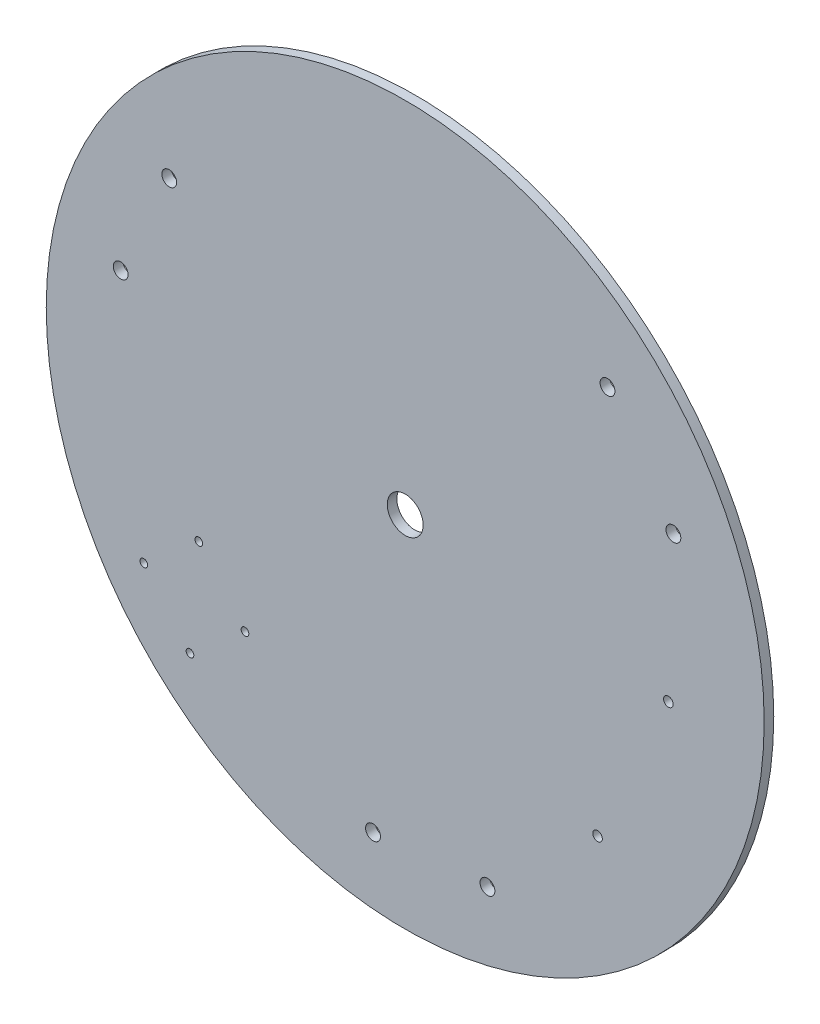
ISO-10303-21;
HEADER;
FILE_DESCRIPTION(('STEP AP214'),'2;1');
FILE_NAME('part.step','',(''),(''),'','','');
FILE_SCHEMA(('AUTOMOTIVE_DESIGN { 1 0 10303 214 1 1 1 1 }'));
ENDSEC;
DATA;
#1=APPLICATION_CONTEXT('core data for automotive mechanical design processes');
#2=APPLICATION_PROTOCOL_DEFINITION('international standard','automotive_design',2000,#1);
#3=PRODUCT_CONTEXT('',#1,'mechanical');
#4=PRODUCT('Part','Part','',(#3));
#5=PRODUCT_RELATED_PRODUCT_CATEGORY('part','',(#4));
#6=PRODUCT_DEFINITION_FORMATION('','',#4);
#7=PRODUCT_DEFINITION_CONTEXT('part definition',#1,'design');
#8=PRODUCT_DEFINITION('design','',#6,#7);
#9=PRODUCT_DEFINITION_SHAPE('','',#8);
#10=(LENGTH_UNIT() NAMED_UNIT(*) SI_UNIT(.MILLI.,.METRE.));
#11=(NAMED_UNIT(*) PLANE_ANGLE_UNIT() SI_UNIT($,.RADIAN.));
#12=(NAMED_UNIT(*) SI_UNIT($,.STERADIAN.) SOLID_ANGLE_UNIT());
#13=UNCERTAINTY_MEASURE_WITH_UNIT(LENGTH_MEASURE(1.E-05),#10,'distance_accuracy_value','');
#14=(GEOMETRIC_REPRESENTATION_CONTEXT(3) GLOBAL_UNCERTAINTY_ASSIGNED_CONTEXT((#13)) GLOBAL_UNIT_ASSIGNED_CONTEXT((#10,
#11,#12)) REPRESENTATION_CONTEXT('',''));
#15=CARTESIAN_POINT('',(0.,0.,0.));
#16=DIRECTION('',(0.,0.,1.));
#17=DIRECTION('',(1.,0.,0.));
#18=AXIS2_PLACEMENT_3D('',#15,#16,#17);
#19=CARTESIAN_POINT('',(0.,0.,4.));
#20=DIRECTION('',(0.,0.,-1.));
#21=DIRECTION('',(-1.,0.,0.));
#22=AXIS2_PLACEMENT_3D('',#19,#20,#21);
#23=CYLINDRICAL_SURFACE('',#22,150.);
#24=CARTESIAN_POINT('',(0.,0.,4.));
#25=DIRECTION('',(0.,0.,1.));
#26=DIRECTION('',(1.,0.,0.));
#27=AXIS2_PLACEMENT_3D('',#24,#25,#26);
#28=CIRCLE('',#27,150.);
#29=CARTESIAN_POINT('',(150.,0.,4.));
#30=VERTEX_POINT('',#29);
#31=EDGE_CURVE('E10',#30,#30,#28,.T.);
#32=ORIENTED_EDGE('',*,*,#31,.F.);
#33=EDGE_LOOP('',(#32));
#34=FACE_BOUND('',#33,.T.);
#35=CARTESIAN_POINT('',(0.,0.,0.));
#36=DIRECTION('',(0.,0.,1.));
#37=DIRECTION('',(1.,0.,0.));
#38=AXIS2_PLACEMENT_3D('',#35,#36,#37);
#39=CIRCLE('',#38,150.);
#40=CARTESIAN_POINT('',(150.,0.,0.));
#41=VERTEX_POINT('',#40);
#42=EDGE_CURVE('E37',#41,#41,#39,.T.);
#43=ORIENTED_EDGE('',*,*,#42,.T.);
#44=EDGE_LOOP('',(#43));
#45=FACE_BOUND('',#44,.T.);
#46=ADVANCED_FACE('F34',(#34,#45),#23,.T.);
#47=CARTESIAN_POINT('',(0.,0.,4.));
#48=DIRECTION('',(0.,0.,1.));
#49=DIRECTION('',(1.,0.,0.));
#50=AXIS2_PLACEMENT_3D('',#47,#48,#49);
#51=PLANE('',#50);
#52=CARTESIAN_POINT('',(-66.9626301666005,-75.7694276154379,4.));
#53=DIRECTION('',(0.,0.,1.));
#54=DIRECTION('',(1.,0.,0.));
#55=AXIS2_PLACEMENT_3D('',#52,#53,#54);
#56=CIRCLE('',#55,1.60000000000001);
#57=CARTESIAN_POINT('',(-65.3626301666005,-75.7694276154379,4.));
#58=VERTEX_POINT('',#57);
#59=EDGE_CURVE('E99',#58,#58,#56,.F.);
#60=ORIENTED_EDGE('',*,*,#59,.T.);
#61=EDGE_LOOP('',(#60));
#62=FACE_BOUND('',#61,.T.);
#63=CARTESIAN_POINT('',(-89.9439634601701,-95.0530559060338,4.));
#64=DIRECTION('',(0.,0.,1.));
#65=DIRECTION('',(1.,0.,0.));
#66=AXIS2_PLACEMENT_3D('',#63,#64,#65);
#67=CIRCLE('',#66,1.60000000000001);
#68=CARTESIAN_POINT('',(-88.3439634601701,-95.0530559060338,4.));
#69=VERTEX_POINT('',#68);
#70=EDGE_CURVE('E110',#69,#69,#67,.F.);
#71=ORIENTED_EDGE('',*,*,#70,.T.);
#72=EDGE_LOOP('',(#71));
#73=FACE_BOUND('',#72,.T.);
#74=CARTESIAN_POINT('',(-109.227591750766,-72.0717226124643,4.));
#75=DIRECTION('',(0.,0.,1.));
#76=DIRECTION('',(1.,0.,0.));
#77=AXIS2_PLACEMENT_3D('',#74,#75,#76);
#78=CIRCLE('',#77,1.60000000000001);
#79=CARTESIAN_POINT('',(-107.627591750766,-72.0717226124643,4.));
#80=VERTEX_POINT('',#79);
#81=EDGE_CURVE('E103',#80,#80,#78,.F.);
#82=ORIENTED_EDGE('',*,*,#81,.T.);
#83=EDGE_LOOP('',(#82));
#84=FACE_BOUND('',#83,.T.);
#85=CARTESIAN_POINT('',(-86.2462584571964,-52.7880943218684,4.));
#86=DIRECTION('',(0.,0.,1.));
#87=DIRECTION('',(1.,0.,0.));
#88=AXIS2_PLACEMENT_3D('',#85,#86,#87);
#89=CIRCLE('',#88,1.60000000000001);
#90=CARTESIAN_POINT('',(-84.6462584571965,-52.7880943218684,4.));
#91=VERTEX_POINT('',#90);
#92=EDGE_CURVE('E104',#91,#91,#89,.F.);
#93=ORIENTED_EDGE('',*,*,#92,.T.);
#94=EDGE_LOOP('',(#93));
#95=FACE_BOUND('',#94,.T.);
#96=CARTESIAN_POINT('',(0.,0.,4.));
#97=DIRECTION('',(0.,0.,1.));
#98=DIRECTION('',(1.,0.,0.));
#99=AXIS2_PLACEMENT_3D('',#96,#97,#98);
#100=CIRCLE('',#99,7.5);
#101=CARTESIAN_POINT('',(7.5,0.,4.));
#102=VERTEX_POINT('',#101);
#103=EDGE_CURVE('E89',#102,#102,#100,.F.);
#104=ORIENTED_EDGE('',*,*,#103,.T.);
#105=EDGE_LOOP('',(#104));
#106=FACE_BOUND('',#105,.T.);
#107=CARTESIAN_POINT('',(109.953956799773,-12.6541449364913,4.));
#108=DIRECTION('',(0.,0.,1.));
#109=DIRECTION('',(1.,0.,0.));
#110=AXIS2_PLACEMENT_3D('',#107,#108,#109);
#111=CIRCLE('',#110,2.);
#112=CARTESIAN_POINT('',(111.953956799773,-12.6541449364913,4.));
#113=VERTEX_POINT('',#112);
#114=EDGE_CURVE('E65',#113,#113,#111,.F.);
#115=ORIENTED_EDGE('',*,*,#114,.T.);
#116=EDGE_LOOP('',(#115));
#117=FACE_BOUND('',#116,.T.);
#118=CARTESIAN_POINT('',(80.3706784779234,-76.0956900290566,4.));
#119=DIRECTION('',(0.,0.,1.));
#120=DIRECTION('',(1.,0.,0.));
#121=AXIS2_PLACEMENT_3D('',#118,#119,#120);
#122=CIRCLE('',#121,2.);
#123=CARTESIAN_POINT('',(82.3706784779234,-76.0956900290566,4.));
#124=VERTEX_POINT('',#123);
#125=EDGE_CURVE('E86',#124,#124,#122,.F.);
#126=ORIENTED_EDGE('',*,*,#125,.T.);
#127=EDGE_LOOP('',(#126));
#128=FACE_BOUND('',#127,.T.);
#129=CARTESIAN_POINT('',(34.3673618839201,-117.451625945066,4.));
#130=DIRECTION('',(0.,0.,1.));
#131=DIRECTION('',(1.,0.,0.));
#132=AXIS2_PLACEMENT_3D('',#129,#130,#131);
#133=CIRCLE('',#132,3.1);
#134=CARTESIAN_POINT('',(37.4673618839201,-117.451625945066,4.));
#135=VERTEX_POINT('',#134);
#136=EDGE_CURVE('E53',#135,#135,#133,.F.);
#137=ORIENTED_EDGE('',*,*,#136,.T.);
#138=EDGE_LOOP('',(#137));
#139=FACE_BOUND('',#138,.T.);
#140=CARTESIAN_POINT('',(-13.4499836244839,-121.635101596953,4.));
#141=DIRECTION('',(0.,0.,1.));
#142=DIRECTION('',(1.,0.,0.));
#143=AXIS2_PLACEMENT_3D('',#140,#141,#142);
#144=CIRCLE('',#143,3.1);
#145=CARTESIAN_POINT('',(-10.3499836244839,-121.635101596953,4.));
#146=VERTEX_POINT('',#145);
#147=EDGE_CURVE('E72',#146,#146,#144,.F.);
#148=ORIENTED_EDGE('',*,*,#147,.T.);
#149=EDGE_LOOP('',(#148));
#150=FACE_BOUND('',#149,.T.);
#151=CARTESIAN_POINT('',(-118.899772726174,28.9628045200057,4.));
#152=DIRECTION('',(0.,0.,1.));
#153=DIRECTION('',(1.,0.,0.));
#154=AXIS2_PLACEMENT_3D('',#151,#152,#153);
#155=CIRCLE('',#154,3.1);
#156=CARTESIAN_POINT('',(-115.799772726174,28.9628045200057,4.));
#157=VERTEX_POINT('',#156);
#158=EDGE_CURVE('E66',#157,#157,#155,.F.);
#159=ORIENTED_EDGE('',*,*,#158,.T.);
#160=EDGE_LOOP('',(#159));
#161=FACE_BOUND('',#160,.T.);
#162=CARTESIAN_POINT('',(-98.6140961626203,72.4655782977648,4.));
#163=DIRECTION('',(0.,0.,1.));
#164=DIRECTION('',(1.,0.,0.));
#165=AXIS2_PLACEMENT_3D('',#162,#163,#164);
#166=CIRCLE('',#165,3.1);
#167=CARTESIAN_POINT('',(-95.5140961626203,72.4655782977648,4.));
#168=VERTEX_POINT('',#167);
#169=EDGE_CURVE('E58',#168,#168,#166,.F.);
#170=ORIENTED_EDGE('',*,*,#169,.T.);
#171=EDGE_LOOP('',(#170));
#172=FACE_BOUND('',#171,.T.);
#173=CARTESIAN_POINT('',(84.5324108422541,88.4888214250612,4.));
#174=DIRECTION('',(0.,0.,1.));
#175=DIRECTION('',(1.,0.,0.));
#176=AXIS2_PLACEMENT_3D('',#173,#174,#175);
#177=CIRCLE('',#176,3.1);
#178=CARTESIAN_POINT('',(87.6324108422541,88.4888214250612,4.));
#179=VERTEX_POINT('',#178);
#180=EDGE_CURVE('E44',#179,#179,#177,.F.);
#181=ORIENTED_EDGE('',*,*,#180,.T.);
#182=EDGE_LOOP('',(#181));
#183=FACE_BOUND('',#182,.T.);
#184=CARTESIAN_POINT('',(112.064079787104,49.1695232991894,4.));
#185=DIRECTION('',(0.,0.,1.));
#186=DIRECTION('',(1.,0.,0.));
#187=AXIS2_PLACEMENT_3D('',#184,#185,#186);
#188=CIRCLE('',#187,3.1);
#189=CARTESIAN_POINT('',(115.164079787104,49.1695232991894,4.));
#190=VERTEX_POINT('',#189);
#191=EDGE_CURVE('E50',#190,#190,#188,.F.);
#192=ORIENTED_EDGE('',*,*,#191,.T.);
#193=EDGE_LOOP('',(#192));
#194=FACE_BOUND('',#193,.T.);
#195=ORIENTED_EDGE('',*,*,#31,.T.);
#196=EDGE_LOOP('',(#195));
#197=FACE_BOUND('',#196,.T.);
#198=ADVANCED_FACE('F131',(#62,#73,#84,#95,#106,#117,#128,#139,#150,#161,#172,#183,#194,#197),
#51,.T.);
#199=CARTESIAN_POINT('',(0.,0.,0.));
#200=DIRECTION('',(0.,0.,1.));
#201=DIRECTION('',(1.,0.,0.));
#202=AXIS2_PLACEMENT_3D('',#199,#200,#201);
#203=PLANE('',#202);
#204=CARTESIAN_POINT('',(-66.9626301666005,-75.7694276154379,0.));
#205=DIRECTION('',(0.,0.,-1.));
#206=DIRECTION('',(-1.,0.,0.));
#207=AXIS2_PLACEMENT_3D('',#204,#205,#206);
#208=CIRCLE('',#207,1.60000000000001);
#209=CARTESIAN_POINT('',(-68.5626301666005,-75.7694276154379,0.));
#210=VERTEX_POINT('',#209);
#211=EDGE_CURVE('E116',#210,#210,#208,.T.);
#212=ORIENTED_EDGE('',*,*,#211,.F.);
#213=EDGE_LOOP('',(#212));
#214=FACE_BOUND('',#213,.T.);
#215=CARTESIAN_POINT('',(-89.9439634601701,-95.0530559060338,0.));
#216=DIRECTION('',(0.,0.,-1.));
#217=DIRECTION('',(-1.,0.,0.));
#218=AXIS2_PLACEMENT_3D('',#215,#216,#217);
#219=CIRCLE('',#218,1.60000000000001);
#220=CARTESIAN_POINT('',(-91.5439634601701,-95.0530559060338,0.));
#221=VERTEX_POINT('',#220);
#222=EDGE_CURVE('E113',#221,#221,#219,.T.);
#223=ORIENTED_EDGE('',*,*,#222,.F.);
#224=EDGE_LOOP('',(#223));
#225=FACE_BOUND('',#224,.T.);
#226=CARTESIAN_POINT('',(-109.227591750766,-72.0717226124643,0.));
#227=DIRECTION('',(0.,0.,-1.));
#228=DIRECTION('',(-1.,0.,0.));
#229=AXIS2_PLACEMENT_3D('',#226,#227,#228);
#230=CIRCLE('',#229,1.60000000000001);
#231=CARTESIAN_POINT('',(-110.827591750766,-72.0717226124643,0.));
#232=VERTEX_POINT('',#231);
#233=EDGE_CURVE('E107',#232,#232,#230,.T.);
#234=ORIENTED_EDGE('',*,*,#233,.F.);
#235=EDGE_LOOP('',(#234));
#236=FACE_BOUND('',#235,.T.);
#237=CARTESIAN_POINT('',(-86.2462584571964,-52.7880943218684,0.));
#238=DIRECTION('',(0.,0.,-1.));
#239=DIRECTION('',(-1.,0.,0.));
#240=AXIS2_PLACEMENT_3D('',#237,#238,#239);
#241=CIRCLE('',#240,1.60000000000001);
#242=CARTESIAN_POINT('',(-87.8462584571965,-52.7880943218684,0.));
#243=VERTEX_POINT('',#242);
#244=EDGE_CURVE('E100',#243,#243,#241,.T.);
#245=ORIENTED_EDGE('',*,*,#244,.F.);
#246=EDGE_LOOP('',(#245));
#247=FACE_BOUND('',#246,.T.);
#248=CARTESIAN_POINT('',(0.,0.,0.));
#249=DIRECTION('',(0.,0.,-1.));
#250=DIRECTION('',(-1.,0.,0.));
#251=AXIS2_PLACEMENT_3D('',#248,#249,#250);
#252=CIRCLE('',#251,7.5);
#253=CARTESIAN_POINT('',(-7.5,0.,0.));
#254=VERTEX_POINT('',#253);
#255=EDGE_CURVE('E96',#254,#254,#252,.T.);
#256=ORIENTED_EDGE('',*,*,#255,.F.);
#257=EDGE_LOOP('',(#256));
#258=FACE_BOUND('',#257,.T.);
#259=CARTESIAN_POINT('',(109.953956799773,-12.6541449364913,0.));
#260=DIRECTION('',(0.,0.,-1.));
#261=DIRECTION('',(-1.,0.,0.));
#262=AXIS2_PLACEMENT_3D('',#259,#260,#261);
#263=CIRCLE('',#262,2.);
#264=CARTESIAN_POINT('',(107.953956799773,-12.6541449364913,0.));
#265=VERTEX_POINT('',#264);
#266=EDGE_CURVE('E85',#265,#265,#263,.T.);
#267=ORIENTED_EDGE('',*,*,#266,.F.);
#268=EDGE_LOOP('',(#267));
#269=FACE_BOUND('',#268,.T.);
#270=CARTESIAN_POINT('',(80.3706784779234,-76.0956900290566,0.));
#271=DIRECTION('',(0.,0.,-1.));
#272=DIRECTION('',(-1.,0.,0.));
#273=AXIS2_PLACEMENT_3D('',#270,#271,#272);
#274=CIRCLE('',#273,2.);
#275=CARTESIAN_POINT('',(78.3706784779234,-76.0956900290566,0.));
#276=VERTEX_POINT('',#275);
#277=EDGE_CURVE('E82',#276,#276,#274,.T.);
#278=ORIENTED_EDGE('',*,*,#277,.F.);
#279=EDGE_LOOP('',(#278));
#280=FACE_BOUND('',#279,.T.);
#281=CARTESIAN_POINT('',(34.3673618839201,-117.451625945066,0.));
#282=DIRECTION('',(0.,0.,-1.));
#283=DIRECTION('',(0.500000000000004,0.866025403784436,0.));
#284=AXIS2_PLACEMENT_3D('',#281,#282,#283);
#285=CIRCLE('',#284,3.1);
#286=CARTESIAN_POINT('',(35.9173618839201,-114.766947193334,0.));
#287=VERTEX_POINT('',#286);
#288=EDGE_CURVE('E75',#287,#287,#285,.T.);
#289=ORIENTED_EDGE('',*,*,#288,.F.);
#290=EDGE_LOOP('',(#289));
#291=FACE_BOUND('',#290,.T.);
#292=CARTESIAN_POINT('',(-13.4499836244839,-121.635101596953,0.));
#293=DIRECTION('',(0.,0.,-1.));
#294=DIRECTION('',(-0.500000000000004,-0.866025403784436,0.));
#295=AXIS2_PLACEMENT_3D('',#292,#293,#294);
#296=CIRCLE('',#295,3.1);
#297=CARTESIAN_POINT('',(-14.9999836244839,-124.319780348685,0.));
#298=VERTEX_POINT('',#297);
#299=EDGE_CURVE('E69',#298,#298,#296,.T.);
#300=ORIENTED_EDGE('',*,*,#299,.F.);
#301=EDGE_LOOP('',(#300));
#302=FACE_BOUND('',#301,.T.);
#303=CARTESIAN_POINT('',(-118.899772726174,28.9628045200057,0.));
#304=DIRECTION('',(0.,0.,-1.));
#305=DIRECTION('',(0.499999999999992,-0.866025403784443,0.));
#306=AXIS2_PLACEMENT_3D('',#303,#304,#305);
#307=CIRCLE('',#306,3.1);
#308=CARTESIAN_POINT('',(-117.349772726174,26.2781257682739,0.));
#309=VERTEX_POINT('',#308);
#310=EDGE_CURVE('E61',#309,#309,#307,.T.);
#311=ORIENTED_EDGE('',*,*,#310,.F.);
#312=EDGE_LOOP('',(#311));
#313=FACE_BOUND('',#312,.T.);
#314=CARTESIAN_POINT('',(-98.6140961626203,72.4655782977648,0.));
#315=DIRECTION('',(0.,0.,-1.));
#316=DIRECTION('',(-0.499999999999992,0.866025403784443,0.));
#317=AXIS2_PLACEMENT_3D('',#314,#315,#316);
#318=CIRCLE('',#317,3.1);
#319=CARTESIAN_POINT('',(-100.16409616262,75.1502570494966,0.));
#320=VERTEX_POINT('',#319);
#321=EDGE_CURVE('E62',#320,#320,#318,.T.);
#322=ORIENTED_EDGE('',*,*,#321,.F.);
#323=EDGE_LOOP('',(#322));
#324=FACE_BOUND('',#323,.T.);
#325=CARTESIAN_POINT('',(84.5324108422541,88.4888214250612,0.));
#326=DIRECTION('',(0.,0.,-1.));
#327=DIRECTION('',(-1.,0.,0.));
#328=AXIS2_PLACEMENT_3D('',#325,#326,#327);
#329=CIRCLE('',#328,3.1);
#330=CARTESIAN_POINT('',(81.4324108422541,88.4888214250612,0.));
#331=VERTEX_POINT('',#330);
#332=EDGE_CURVE('E49',#331,#331,#329,.T.);
#333=ORIENTED_EDGE('',*,*,#332,.F.);
#334=EDGE_LOOP('',(#333));
#335=FACE_BOUND('',#334,.T.);
#336=CARTESIAN_POINT('',(112.064079787104,49.1695232991894,0.));
#337=DIRECTION('',(0.,0.,-1.));
#338=DIRECTION('',(1.,0.,0.));
#339=AXIS2_PLACEMENT_3D('',#336,#337,#338);
#340=CIRCLE('',#339,3.1);
#341=CARTESIAN_POINT('',(115.164079787104,49.1695232991894,0.));
#342=VERTEX_POINT('',#341);
#343=EDGE_CURVE('E46',#342,#342,#340,.T.);
#344=ORIENTED_EDGE('',*,*,#343,.F.);
#345=EDGE_LOOP('',(#344));
#346=FACE_BOUND('',#345,.T.);
#347=ORIENTED_EDGE('',*,*,#42,.F.);
#348=EDGE_LOOP('',(#347));
#349=FACE_BOUND('',#348,.T.);
#350=ADVANCED_FACE('F127',(#214,#225,#236,#247,#258,#269,#280,#291,#302,#313,#324,#335,#346,
#349),#203,.F.);
#351=CARTESIAN_POINT('',(112.064079787104,49.1695232991894,12.7681240867132));
#352=DIRECTION('',(0.,0.,-1.));
#353=DIRECTION('',(-1.,0.,0.));
#354=AXIS2_PLACEMENT_3D('',#351,#352,#353);
#355=CYLINDRICAL_SURFACE('',#354,3.1);
#356=ORIENTED_EDGE('',*,*,#343,.T.);
#357=EDGE_LOOP('',(#356));
#358=FACE_BOUND('',#357,.T.);
#359=ORIENTED_EDGE('',*,*,#191,.F.);
#360=EDGE_LOOP('',(#359));
#361=FACE_BOUND('',#360,.T.);
#362=ADVANCED_FACE('F130',(#358,#361),#355,.F.);
#363=CARTESIAN_POINT('',(84.5324108422541,88.4888214250612,12.7681240867132));
#364=DIRECTION('',(0.,0.,-1.));
#365=DIRECTION('',(-1.,0.,0.));
#366=AXIS2_PLACEMENT_3D('',#363,#364,#365);
#367=CYLINDRICAL_SURFACE('',#366,3.1);
#368=ORIENTED_EDGE('',*,*,#332,.T.);
#369=EDGE_LOOP('',(#368));
#370=FACE_BOUND('',#369,.T.);
#371=ORIENTED_EDGE('',*,*,#180,.F.);
#372=EDGE_LOOP('',(#371));
#373=FACE_BOUND('',#372,.T.);
#374=ADVANCED_FACE('F171',(#370,#373),#367,.F.);
#375=CARTESIAN_POINT('',(-98.6140961626203,72.4655782977648,12.7681240867132));
#376=DIRECTION('',(0.,0.,-1.));
#377=DIRECTION('',(-1.,0.,0.));
#378=AXIS2_PLACEMENT_3D('',#375,#376,#377);
#379=CYLINDRICAL_SURFACE('',#378,3.1);
#380=ORIENTED_EDGE('',*,*,#321,.T.);
#381=EDGE_LOOP('',(#380));
#382=FACE_BOUND('',#381,.T.);
#383=ORIENTED_EDGE('',*,*,#169,.F.);
#384=EDGE_LOOP('',(#383));
#385=FACE_BOUND('',#384,.T.);
#386=ADVANCED_FACE('F175',(#382,#385),#379,.F.);
#387=CARTESIAN_POINT('',(-118.899772726174,28.9628045200057,12.7681240867132));
#388=DIRECTION('',(0.,0.,-1.));
#389=DIRECTION('',(-1.,0.,0.));
#390=AXIS2_PLACEMENT_3D('',#387,#388,#389);
#391=CYLINDRICAL_SURFACE('',#390,3.1);
#392=ORIENTED_EDGE('',*,*,#310,.T.);
#393=EDGE_LOOP('',(#392));
#394=FACE_BOUND('',#393,.T.);
#395=ORIENTED_EDGE('',*,*,#158,.F.);
#396=EDGE_LOOP('',(#395));
#397=FACE_BOUND('',#396,.T.);
#398=ADVANCED_FACE('F179',(#394,#397),#391,.F.);
#399=CARTESIAN_POINT('',(-13.4499836244839,-121.635101596953,12.7681240867132));
#400=DIRECTION('',(0.,0.,-1.));
#401=DIRECTION('',(-1.,0.,0.));
#402=AXIS2_PLACEMENT_3D('',#399,#400,#401);
#403=CYLINDRICAL_SURFACE('',#402,3.1);
#404=ORIENTED_EDGE('',*,*,#299,.T.);
#405=EDGE_LOOP('',(#404));
#406=FACE_BOUND('',#405,.T.);
#407=ORIENTED_EDGE('',*,*,#147,.F.);
#408=EDGE_LOOP('',(#407));
#409=FACE_BOUND('',#408,.T.);
#410=ADVANCED_FACE('F183',(#406,#409),#403,.F.);
#411=CARTESIAN_POINT('',(34.3673618839201,-117.451625945066,12.7681240867132));
#412=DIRECTION('',(0.,0.,-1.));
#413=DIRECTION('',(-1.,0.,0.));
#414=AXIS2_PLACEMENT_3D('',#411,#412,#413);
#415=CYLINDRICAL_SURFACE('',#414,3.1);
#416=ORIENTED_EDGE('',*,*,#288,.T.);
#417=EDGE_LOOP('',(#416));
#418=FACE_BOUND('',#417,.T.);
#419=ORIENTED_EDGE('',*,*,#136,.F.);
#420=EDGE_LOOP('',(#419));
#421=FACE_BOUND('',#420,.T.);
#422=ADVANCED_FACE('F187',(#418,#421),#415,.F.);
#423=CARTESIAN_POINT('',(80.3706784779234,-76.0956900290566,9.65685424949239));
#424=DIRECTION('',(0.,0.,-1.));
#425=DIRECTION('',(-1.,0.,0.));
#426=AXIS2_PLACEMENT_3D('',#423,#424,#425);
#427=CYLINDRICAL_SURFACE('',#426,2.);
#428=ORIENTED_EDGE('',*,*,#277,.T.);
#429=EDGE_LOOP('',(#428));
#430=FACE_BOUND('',#429,.T.);
#431=ORIENTED_EDGE('',*,*,#125,.F.);
#432=EDGE_LOOP('',(#431));
#433=FACE_BOUND('',#432,.T.);
#434=ADVANCED_FACE('F191',(#430,#433),#427,.F.);
#435=CARTESIAN_POINT('',(109.953956799773,-12.6541449364913,9.65685424949239));
#436=DIRECTION('',(0.,0.,-1.));
#437=DIRECTION('',(-1.,0.,0.));
#438=AXIS2_PLACEMENT_3D('',#435,#436,#437);
#439=CYLINDRICAL_SURFACE('',#438,2.);
#440=ORIENTED_EDGE('',*,*,#266,.T.);
#441=EDGE_LOOP('',(#440));
#442=FACE_BOUND('',#441,.T.);
#443=ORIENTED_EDGE('',*,*,#114,.F.);
#444=EDGE_LOOP('',(#443));
#445=FACE_BOUND('',#444,.T.);
#446=ADVANCED_FACE('F195',(#442,#445),#439,.F.);
#447=CARTESIAN_POINT('',(0.,0.,25.2132034355964));
#448=DIRECTION('',(0.,0.,-1.));
#449=DIRECTION('',(-1.,0.,0.));
#450=AXIS2_PLACEMENT_3D('',#447,#448,#449);
#451=CYLINDRICAL_SURFACE('',#450,7.5);
#452=ORIENTED_EDGE('',*,*,#255,.T.);
#453=EDGE_LOOP('',(#452));
#454=FACE_BOUND('',#453,.T.);
#455=ORIENTED_EDGE('',*,*,#103,.F.);
#456=EDGE_LOOP('',(#455));
#457=FACE_BOUND('',#456,.T.);
#458=ADVANCED_FACE('F199',(#454,#457),#451,.F.);
#459=CARTESIAN_POINT('',(-86.2462584571964,-52.7880943218684,8.52548339959392));
#460=DIRECTION('',(0.,0.,-1.));
#461=DIRECTION('',(-1.,0.,0.));
#462=AXIS2_PLACEMENT_3D('',#459,#460,#461);
#463=CYLINDRICAL_SURFACE('',#462,1.60000000000001);
#464=ORIENTED_EDGE('',*,*,#244,.T.);
#465=EDGE_LOOP('',(#464));
#466=FACE_BOUND('',#465,.T.);
#467=ORIENTED_EDGE('',*,*,#92,.F.);
#468=EDGE_LOOP('',(#467));
#469=FACE_BOUND('',#468,.T.);
#470=ADVANCED_FACE('F203',(#466,#469),#463,.F.);
#471=CARTESIAN_POINT('',(-109.227591750766,-72.0717226124643,8.52548339959392));
#472=DIRECTION('',(0.,0.,-1.));
#473=DIRECTION('',(-1.,0.,0.));
#474=AXIS2_PLACEMENT_3D('',#471,#472,#473);
#475=CYLINDRICAL_SURFACE('',#474,1.60000000000001);
#476=ORIENTED_EDGE('',*,*,#233,.T.);
#477=EDGE_LOOP('',(#476));
#478=FACE_BOUND('',#477,.T.);
#479=ORIENTED_EDGE('',*,*,#81,.F.);
#480=EDGE_LOOP('',(#479));
#481=FACE_BOUND('',#480,.T.);
#482=ADVANCED_FACE('F207',(#478,#481),#475,.F.);
#483=CARTESIAN_POINT('',(-89.9439634601701,-95.0530559060338,8.52548339959392));
#484=DIRECTION('',(0.,0.,-1.));
#485=DIRECTION('',(-1.,0.,0.));
#486=AXIS2_PLACEMENT_3D('',#483,#484,#485);
#487=CYLINDRICAL_SURFACE('',#486,1.60000000000001);
#488=ORIENTED_EDGE('',*,*,#222,.T.);
#489=EDGE_LOOP('',(#488));
#490=FACE_BOUND('',#489,.T.);
#491=ORIENTED_EDGE('',*,*,#70,.F.);
#492=EDGE_LOOP('',(#491));
#493=FACE_BOUND('',#492,.T.);
#494=ADVANCED_FACE('F211',(#490,#493),#487,.F.);
#495=CARTESIAN_POINT('',(-66.9626301666005,-75.7694276154379,8.52548339959392));
#496=DIRECTION('',(0.,0.,-1.));
#497=DIRECTION('',(-1.,0.,0.));
#498=AXIS2_PLACEMENT_3D('',#495,#496,#497);
#499=CYLINDRICAL_SURFACE('',#498,1.60000000000001);
#500=ORIENTED_EDGE('',*,*,#211,.T.);
#501=EDGE_LOOP('',(#500));
#502=FACE_BOUND('',#501,.T.);
#503=ORIENTED_EDGE('',*,*,#59,.F.);
#504=EDGE_LOOP('',(#503));
#505=FACE_BOUND('',#504,.T.);
#506=ADVANCED_FACE('F124',(#502,#505),#499,.F.);
#507=CLOSED_SHELL('',(#46,#198,#350,#362,#374,#386,#398,#410,#422,#434,#446,#458,#470,#482,#494,#506));
#508=MANIFOLD_SOLID_BREP('B2',#507);
#509=ADVANCED_BREP_SHAPE_REPRESENTATION('',(#18,#508),#14);
#510=SHAPE_DEFINITION_REPRESENTATION(#9,#509);
ENDSEC;
END-ISO-10303-21;
